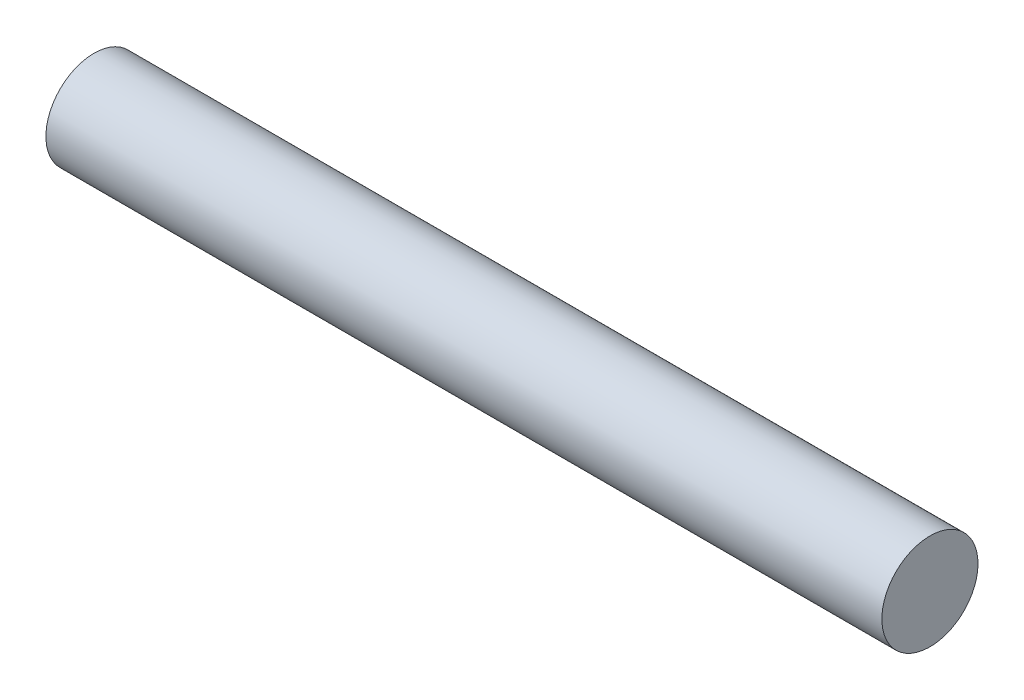
ISO-10303-21;
HEADER;
FILE_DESCRIPTION(('STEP AP214'),'2;1');
FILE_NAME('part.step','',(''),(''),'','','');
FILE_SCHEMA(('AUTOMOTIVE_DESIGN { 1 0 10303 214 1 1 1 1 }'));
ENDSEC;
DATA;
#1=APPLICATION_CONTEXT('core data for automotive mechanical design processes');
#2=APPLICATION_PROTOCOL_DEFINITION('international standard','automotive_design',2000,#1);
#3=PRODUCT_CONTEXT('',#1,'mechanical');
#4=PRODUCT('Part','Part','',(#3));
#5=PRODUCT_RELATED_PRODUCT_CATEGORY('part','',(#4));
#6=PRODUCT_DEFINITION_FORMATION('','',#4);
#7=PRODUCT_DEFINITION_CONTEXT('part definition',#1,'design');
#8=PRODUCT_DEFINITION('design','',#6,#7);
#9=PRODUCT_DEFINITION_SHAPE('','',#8);
#10=(LENGTH_UNIT() NAMED_UNIT(*) SI_UNIT(.MILLI.,.METRE.));
#11=(NAMED_UNIT(*) PLANE_ANGLE_UNIT() SI_UNIT($,.RADIAN.));
#12=(NAMED_UNIT(*) SI_UNIT($,.STERADIAN.) SOLID_ANGLE_UNIT());
#13=UNCERTAINTY_MEASURE_WITH_UNIT(LENGTH_MEASURE(1.E-05),#10,'distance_accuracy_value','');
#14=(GEOMETRIC_REPRESENTATION_CONTEXT(3) GLOBAL_UNCERTAINTY_ASSIGNED_CONTEXT((#13)) GLOBAL_UNIT_ASSIGNED_CONTEXT((#10,
#11,#12)) REPRESENTATION_CONTEXT('',''));
#15=CARTESIAN_POINT('',(0.,0.,0.));
#16=DIRECTION('',(0.,0.,1.));
#17=DIRECTION('',(1.,0.,0.));
#18=AXIS2_PLACEMENT_3D('',#15,#16,#17);
#19=CARTESIAN_POINT('',(20.,0.,0.));
#20=DIRECTION('',(-1.,0.,0.));
#21=DIRECTION('',(0.,0.,1.));
#22=AXIS2_PLACEMENT_3D('',#19,#20,#21);
#23=CYLINDRICAL_SURFACE('',#22,1.15);
#24=CARTESIAN_POINT('',(20.,0.,0.));
#25=DIRECTION('',(1.,0.,0.));
#26=DIRECTION('',(0.,0.,-1.));
#27=AXIS2_PLACEMENT_3D('',#24,#25,#26);
#28=CIRCLE('',#27,1.15);
#29=CARTESIAN_POINT('',(20.,0.,-1.15));
#30=VERTEX_POINT('',#29);
#31=EDGE_CURVE('E10',#30,#30,#28,.T.);
#32=ORIENTED_EDGE('',*,*,#31,.F.);
#33=EDGE_LOOP('',(#32));
#34=FACE_BOUND('',#33,.T.);
#35=CARTESIAN_POINT('',(0.,0.,0.));
#36=DIRECTION('',(1.,0.,0.));
#37=DIRECTION('',(0.,0.,-1.));
#38=AXIS2_PLACEMENT_3D('',#35,#36,#37);
#39=CIRCLE('',#38,1.15);
#40=CARTESIAN_POINT('',(0.,0.,-1.15));
#41=VERTEX_POINT('',#40);
#42=EDGE_CURVE('E34',#41,#41,#39,.T.);
#43=ORIENTED_EDGE('',*,*,#42,.T.);
#44=EDGE_LOOP('',(#43));
#45=FACE_BOUND('',#44,.T.);
#46=ADVANCED_FACE('F31',(#34,#45),#23,.T.);
#47=CARTESIAN_POINT('',(20.,0.,0.));
#48=DIRECTION('',(1.,0.,0.));
#49=DIRECTION('',(0.,0.,-1.));
#50=AXIS2_PLACEMENT_3D('',#47,#48,#49);
#51=PLANE('',#50);
#52=ORIENTED_EDGE('',*,*,#31,.T.);
#53=EDGE_LOOP('',(#52));
#54=FACE_BOUND('',#53,.T.);
#55=ADVANCED_FACE('F46',(#54),#51,.T.);
#56=CARTESIAN_POINT('',(0.,0.,0.));
#57=DIRECTION('',(1.,0.,0.));
#58=DIRECTION('',(0.,0.,-1.));
#59=AXIS2_PLACEMENT_3D('',#56,#57,#58);
#60=PLANE('',#59);
#61=ORIENTED_EDGE('',*,*,#42,.F.);
#62=EDGE_LOOP('',(#61));
#63=FACE_BOUND('',#62,.T.);
#64=ADVANCED_FACE('F44',(#63),#60,.F.);
#65=CLOSED_SHELL('',(#46,#55,#64));
#66=MANIFOLD_SOLID_BREP('B2',#65);
#67=ADVANCED_BREP_SHAPE_REPRESENTATION('',(#18,#66),#14);
#68=SHAPE_DEFINITION_REPRESENTATION(#9,#67);
ENDSEC;
END-ISO-10303-21;
